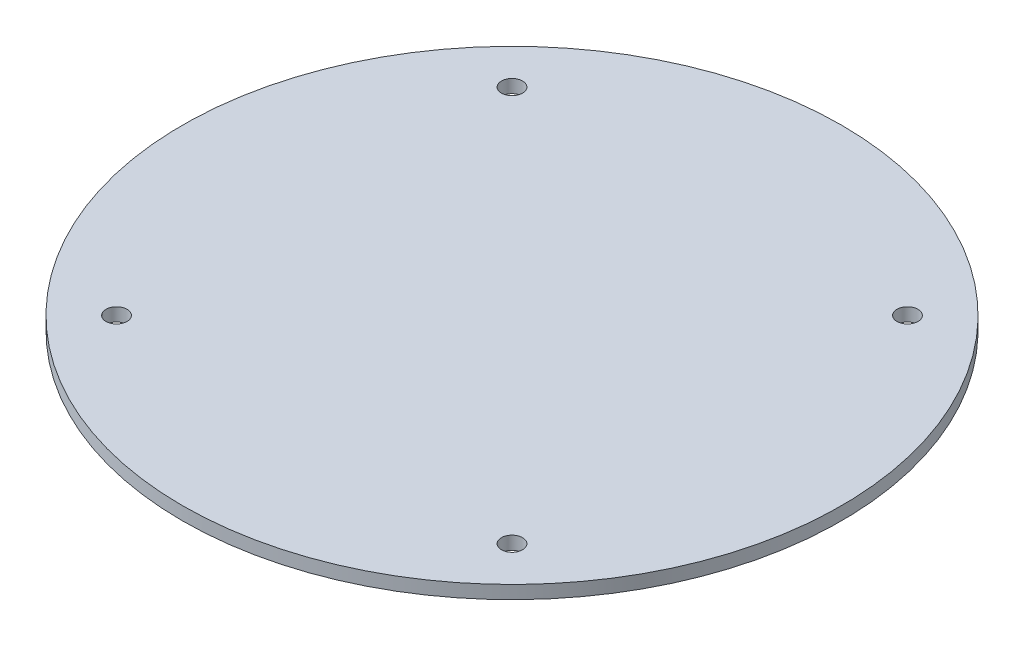
ISO-10303-21;
HEADER;
FILE_DESCRIPTION(('STEP AP214'),'2;1');
FILE_NAME('part.step','',(''),(''),'','','');
FILE_SCHEMA(('AUTOMOTIVE_DESIGN { 1 0 10303 214 1 1 1 1 }'));
ENDSEC;
DATA;
#1=APPLICATION_CONTEXT('core data for automotive mechanical design processes');
#2=APPLICATION_PROTOCOL_DEFINITION('international standard','automotive_design',2000,#1);
#3=PRODUCT_CONTEXT('',#1,'mechanical');
#4=PRODUCT('Part','Part','',(#3));
#5=PRODUCT_RELATED_PRODUCT_CATEGORY('part','',(#4));
#6=PRODUCT_DEFINITION_FORMATION('','',#4);
#7=PRODUCT_DEFINITION_CONTEXT('part definition',#1,'design');
#8=PRODUCT_DEFINITION('design','',#6,#7);
#9=PRODUCT_DEFINITION_SHAPE('','',#8);
#10=(LENGTH_UNIT() NAMED_UNIT(*) SI_UNIT(.MILLI.,.METRE.));
#11=(NAMED_UNIT(*) PLANE_ANGLE_UNIT() SI_UNIT($,.RADIAN.));
#12=(NAMED_UNIT(*) SI_UNIT($,.STERADIAN.) SOLID_ANGLE_UNIT());
#13=UNCERTAINTY_MEASURE_WITH_UNIT(LENGTH_MEASURE(1.E-05),#10,'distance_accuracy_value','');
#14=(GEOMETRIC_REPRESENTATION_CONTEXT(3) GLOBAL_UNCERTAINTY_ASSIGNED_CONTEXT((#13)) GLOBAL_UNIT_ASSIGNED_CONTEXT((#10,
#11,#12)) REPRESENTATION_CONTEXT('',''));
#15=CARTESIAN_POINT('',(0.,0.,0.));
#16=DIRECTION('',(0.,0.,1.));
#17=DIRECTION('',(1.,0.,0.));
#18=AXIS2_PLACEMENT_3D('',#15,#16,#17);
#19=CARTESIAN_POINT('',(0.,2.,0.));
#20=DIRECTION('',(0.,1.,0.));
#21=DIRECTION('',(0.,0.,1.));
#22=AXIS2_PLACEMENT_3D('',#19,#20,#21);
#23=PLANE('',#22);
#24=CARTESIAN_POINT('',(30.,2.,30.));
#25=DIRECTION('',(0.,1.,0.));
#26=DIRECTION('',(0.,0.,1.));
#27=AXIS2_PLACEMENT_3D('',#24,#25,#26);
#28=CIRCLE('',#27,1.6);
#29=CARTESIAN_POINT('',(30.,2.,31.6));
#30=VERTEX_POINT('',#29);
#31=EDGE_CURVE('E53',#30,#30,#28,.T.);
#32=ORIENTED_EDGE('',*,*,#31,.F.);
#33=EDGE_LOOP('',(#32));
#34=FACE_BOUND('',#33,.T.);
#35=CARTESIAN_POINT('',(-30.,2.,-30.));
#36=DIRECTION('',(0.,1.,0.));
#37=DIRECTION('',(0.,0.,1.));
#38=AXIS2_PLACEMENT_3D('',#35,#36,#37);
#39=CIRCLE('',#38,1.6);
#40=CARTESIAN_POINT('',(-30.,2.,-28.4));
#41=VERTEX_POINT('',#40);
#42=EDGE_CURVE('E42',#41,#41,#39,.T.);
#43=ORIENTED_EDGE('',*,*,#42,.F.);
#44=EDGE_LOOP('',(#43));
#45=FACE_BOUND('',#44,.T.);
#46=CARTESIAN_POINT('',(0.,2.,0.));
#47=DIRECTION('',(0.,1.,0.));
#48=DIRECTION('',(0.,0.,1.));
#49=AXIS2_PLACEMENT_3D('',#46,#47,#48);
#50=CIRCLE('',#49,50.);
#51=CARTESIAN_POINT('',(0.,2.,50.));
#52=VERTEX_POINT('',#51);
#53=EDGE_CURVE('E10',#52,#52,#50,.T.);
#54=ORIENTED_EDGE('',*,*,#53,.T.);
#55=EDGE_LOOP('',(#54));
#56=FACE_BOUND('',#55,.T.);
#57=CARTESIAN_POINT('',(30.,2.,-30.));
#58=DIRECTION('',(0.,1.,0.));
#59=DIRECTION('',(0.,0.,-1.));
#60=AXIS2_PLACEMENT_3D('',#57,#58,#59);
#61=CIRCLE('',#60,1.6);
#62=CARTESIAN_POINT('',(30.,2.,-31.6));
#63=VERTEX_POINT('',#62);
#64=EDGE_CURVE('E47',#63,#63,#61,.T.);
#65=ORIENTED_EDGE('',*,*,#64,.F.);
#66=EDGE_LOOP('',(#65));
#67=FACE_BOUND('',#66,.T.);
#68=CARTESIAN_POINT('',(-30.,2.,30.));
#69=DIRECTION('',(0.,1.,0.));
#70=DIRECTION('',(0.,0.,-1.));
#71=AXIS2_PLACEMENT_3D('',#68,#69,#70);
#72=CIRCLE('',#71,1.6);
#73=CARTESIAN_POINT('',(-30.,2.,28.4));
#74=VERTEX_POINT('',#73);
#75=EDGE_CURVE('E59',#74,#74,#72,.T.);
#76=ORIENTED_EDGE('',*,*,#75,.F.);
#77=EDGE_LOOP('',(#76));
#78=FACE_BOUND('',#77,.T.);
#79=ADVANCED_FACE('F31',(#34,#45,#56,#67,#78),#23,.T.);
#80=CARTESIAN_POINT('',(0.,0.,0.));
#81=DIRECTION('',(0.,1.,0.));
#82=DIRECTION('',(0.,0.,1.));
#83=AXIS2_PLACEMENT_3D('',#80,#81,#82);
#84=PLANE('',#83);
#85=CARTESIAN_POINT('',(30.,0.,30.));
#86=DIRECTION('',(0.,1.,0.));
#87=DIRECTION('',(0.,0.,1.));
#88=AXIS2_PLACEMENT_3D('',#85,#86,#87);
#89=CIRCLE('',#88,1.6);
#90=CARTESIAN_POINT('',(30.,0.,31.6));
#91=VERTEX_POINT('',#90);
#92=EDGE_CURVE('E56',#91,#91,#89,.T.);
#93=ORIENTED_EDGE('',*,*,#92,.T.);
#94=EDGE_LOOP('',(#93));
#95=FACE_BOUND('',#94,.T.);
#96=CARTESIAN_POINT('',(-30.,0.,-30.));
#97=DIRECTION('',(0.,1.,0.));
#98=DIRECTION('',(0.,0.,1.));
#99=AXIS2_PLACEMENT_3D('',#96,#97,#98);
#100=CIRCLE('',#99,1.6);
#101=CARTESIAN_POINT('',(-30.,0.,-28.4));
#102=VERTEX_POINT('',#101);
#103=EDGE_CURVE('E44',#102,#102,#100,.T.);
#104=ORIENTED_EDGE('',*,*,#103,.T.);
#105=EDGE_LOOP('',(#104));
#106=FACE_BOUND('',#105,.T.);
#107=CARTESIAN_POINT('',(0.,0.,0.));
#108=DIRECTION('',(0.,1.,0.));
#109=DIRECTION('',(0.,0.,1.));
#110=AXIS2_PLACEMENT_3D('',#107,#108,#109);
#111=CIRCLE('',#110,50.);
#112=CARTESIAN_POINT('',(0.,0.,50.));
#113=VERTEX_POINT('',#112);
#114=EDGE_CURVE('E35',#113,#113,#111,.T.);
#115=ORIENTED_EDGE('',*,*,#114,.F.);
#116=EDGE_LOOP('',(#115));
#117=FACE_BOUND('',#116,.T.);
#118=CARTESIAN_POINT('',(30.,0.,-30.));
#119=DIRECTION('',(0.,1.,0.));
#120=DIRECTION('',(0.,0.,-1.));
#121=AXIS2_PLACEMENT_3D('',#118,#119,#120);
#122=CIRCLE('',#121,1.6);
#123=CARTESIAN_POINT('',(30.,0.,-31.6));
#124=VERTEX_POINT('',#123);
#125=EDGE_CURVE('E50',#124,#124,#122,.T.);
#126=ORIENTED_EDGE('',*,*,#125,.T.);
#127=EDGE_LOOP('',(#126));
#128=FACE_BOUND('',#127,.T.);
#129=CARTESIAN_POINT('',(-30.,0.,30.));
#130=DIRECTION('',(0.,1.,0.));
#131=DIRECTION('',(0.,0.,-1.));
#132=AXIS2_PLACEMENT_3D('',#129,#130,#131);
#133=CIRCLE('',#132,1.6);
#134=CARTESIAN_POINT('',(-30.,0.,28.4));
#135=VERTEX_POINT('',#134);
#136=EDGE_CURVE('E62',#135,#135,#133,.T.);
#137=ORIENTED_EDGE('',*,*,#136,.T.);
#138=EDGE_LOOP('',(#137));
#139=FACE_BOUND('',#138,.T.);
#140=ADVANCED_FACE('F72',(#95,#106,#117,#128,#139),#84,.F.);
#141=CARTESIAN_POINT('',(0.,2.,0.));
#142=DIRECTION('',(0.,-1.,0.));
#143=DIRECTION('',(0.,0.,-1.));
#144=AXIS2_PLACEMENT_3D('',#141,#142,#143);
#145=CYLINDRICAL_SURFACE('',#144,50.);
#146=ORIENTED_EDGE('',*,*,#53,.F.);
#147=EDGE_LOOP('',(#146));
#148=FACE_BOUND('',#147,.T.);
#149=ORIENTED_EDGE('',*,*,#114,.T.);
#150=EDGE_LOOP('',(#149));
#151=FACE_BOUND('',#150,.T.);
#152=ADVANCED_FACE('F33',(#148,#151),#145,.T.);
#153=CARTESIAN_POINT('',(-30.,2.,-30.));
#154=DIRECTION('',(0.,-1.,0.));
#155=DIRECTION('',(0.,0.,-1.));
#156=AXIS2_PLACEMENT_3D('',#153,#154,#155);
#157=CYLINDRICAL_SURFACE('',#156,1.6);
#158=ORIENTED_EDGE('',*,*,#42,.T.);
#159=EDGE_LOOP('',(#158));
#160=FACE_BOUND('',#159,.T.);
#161=ORIENTED_EDGE('',*,*,#103,.F.);
#162=EDGE_LOOP('',(#161));
#163=FACE_BOUND('',#162,.T.);
#164=ADVANCED_FACE('F82',(#160,#163),#157,.F.);
#165=CARTESIAN_POINT('',(30.,2.,-30.));
#166=DIRECTION('',(0.,-1.,0.));
#167=DIRECTION('',(0.,0.,-1.));
#168=AXIS2_PLACEMENT_3D('',#165,#166,#167);
#169=CYLINDRICAL_SURFACE('',#168,1.6);
#170=ORIENTED_EDGE('',*,*,#64,.T.);
#171=EDGE_LOOP('',(#170));
#172=FACE_BOUND('',#171,.T.);
#173=ORIENTED_EDGE('',*,*,#125,.F.);
#174=EDGE_LOOP('',(#173));
#175=FACE_BOUND('',#174,.T.);
#176=ADVANCED_FACE('F85',(#172,#175),#169,.F.);
#177=CARTESIAN_POINT('',(30.,2.,30.));
#178=DIRECTION('',(0.,-1.,0.));
#179=DIRECTION('',(0.,0.,-1.));
#180=AXIS2_PLACEMENT_3D('',#177,#178,#179);
#181=CYLINDRICAL_SURFACE('',#180,1.6);
#182=ORIENTED_EDGE('',*,*,#31,.T.);
#183=EDGE_LOOP('',(#182));
#184=FACE_BOUND('',#183,.T.);
#185=ORIENTED_EDGE('',*,*,#92,.F.);
#186=EDGE_LOOP('',(#185));
#187=FACE_BOUND('',#186,.T.);
#188=ADVANCED_FACE('F89',(#184,#187),#181,.F.);
#189=CARTESIAN_POINT('',(-30.,2.,30.));
#190=DIRECTION('',(0.,-1.,0.));
#191=DIRECTION('',(0.,0.,-1.));
#192=AXIS2_PLACEMENT_3D('',#189,#190,#191);
#193=CYLINDRICAL_SURFACE('',#192,1.6);
#194=ORIENTED_EDGE('',*,*,#75,.T.);
#195=EDGE_LOOP('',(#194));
#196=FACE_BOUND('',#195,.T.);
#197=ORIENTED_EDGE('',*,*,#136,.F.);
#198=EDGE_LOOP('',(#197));
#199=FACE_BOUND('',#198,.T.);
#200=ADVANCED_FACE('F68',(#196,#199),#193,.F.);
#201=CLOSED_SHELL('',(#79,#140,#152,#164,#176,#188,#200));
#202=MANIFOLD_SOLID_BREP('B2',#201);
#203=ADVANCED_BREP_SHAPE_REPRESENTATION('',(#18,#202),#14);
#204=SHAPE_DEFINITION_REPRESENTATION(#9,#203);
ENDSEC;
END-ISO-10303-21;
